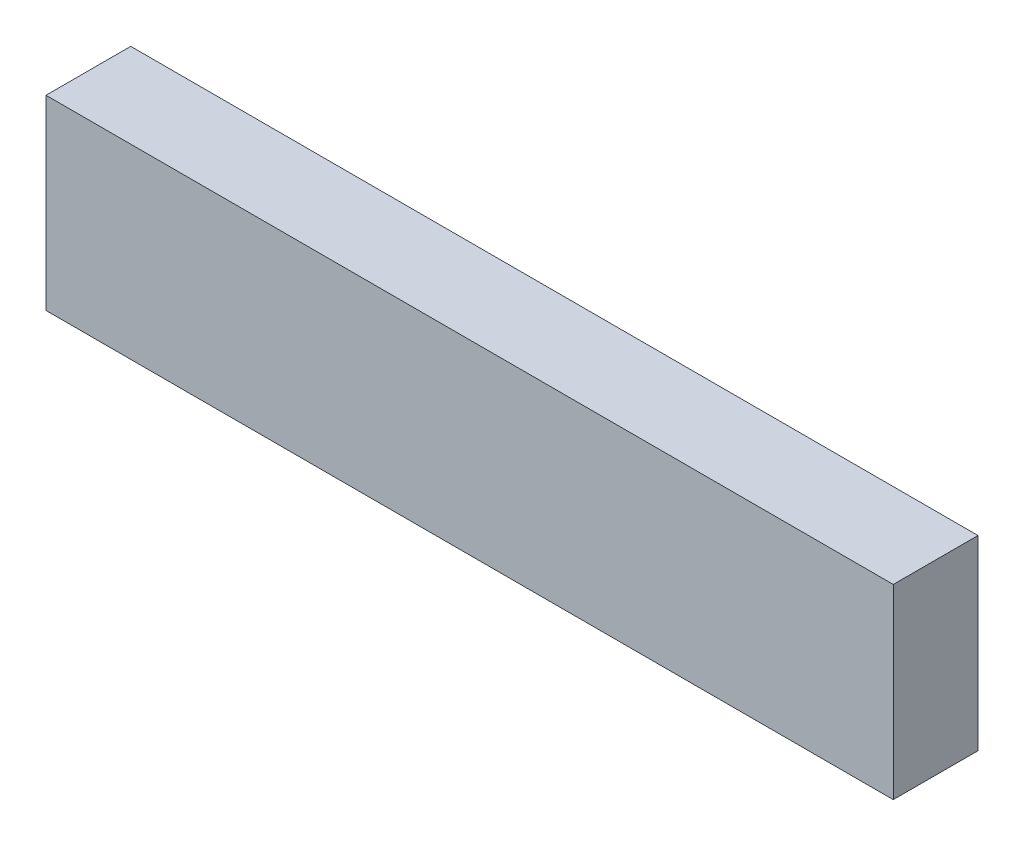
ISO-10303-21;
HEADER;
FILE_DESCRIPTION(('STEP AP214'),'2;1');
FILE_NAME('part.step','',(''),(''),'','','');
FILE_SCHEMA(('AUTOMOTIVE_DESIGN { 1 0 10303 214 1 1 1 1 }'));
ENDSEC;
DATA;
#1=APPLICATION_CONTEXT('core data for automotive mechanical design processes');
#2=APPLICATION_PROTOCOL_DEFINITION('international standard','automotive_design',2000,#1);
#3=PRODUCT_CONTEXT('',#1,'mechanical');
#4=PRODUCT('Part','Part','',(#3));
#5=PRODUCT_RELATED_PRODUCT_CATEGORY('part','',(#4));
#6=PRODUCT_DEFINITION_FORMATION('','',#4);
#7=PRODUCT_DEFINITION_CONTEXT('part definition',#1,'design');
#8=PRODUCT_DEFINITION('design','',#6,#7);
#9=PRODUCT_DEFINITION_SHAPE('','',#8);
#10=(LENGTH_UNIT() NAMED_UNIT(*) SI_UNIT(.MILLI.,.METRE.));
#11=(NAMED_UNIT(*) PLANE_ANGLE_UNIT() SI_UNIT($,.RADIAN.));
#12=(NAMED_UNIT(*) SI_UNIT($,.STERADIAN.) SOLID_ANGLE_UNIT());
#13=UNCERTAINTY_MEASURE_WITH_UNIT(LENGTH_MEASURE(1.E-05),#10,'distance_accuracy_value','');
#14=(GEOMETRIC_REPRESENTATION_CONTEXT(3) GLOBAL_UNCERTAINTY_ASSIGNED_CONTEXT((#13)) GLOBAL_UNIT_ASSIGNED_CONTEXT((#10,
#11,#12)) REPRESENTATION_CONTEXT('',''));
#15=CARTESIAN_POINT('',(0.,0.,0.));
#16=DIRECTION('',(0.,0.,1.));
#17=DIRECTION('',(1.,0.,0.));
#18=AXIS2_PLACEMENT_3D('',#15,#16,#17);
#19=CARTESIAN_POINT('',(-50.,11.,5.));
#20=DIRECTION('',(1.,0.,0.));
#21=DIRECTION('',(0.,0.,-1.));
#22=AXIS2_PLACEMENT_3D('',#19,#20,#21);
#23=PLANE('',#22);
#24=DIRECTION('',(0.,-1.,0.));
#25=VECTOR('',#24,1.);
#26=CARTESIAN_POINT('',(-50.,11.,0.));
#27=LINE('',#26,#25);
#28=CARTESIAN_POINT('',(-50.,11.,0.));
#29=VERTEX_POINT('',#28);
#30=CARTESIAN_POINT('',(-50.,0.,0.));
#31=VERTEX_POINT('',#30);
#32=EDGE_CURVE('E100',#29,#31,#27,.T.);
#33=ORIENTED_EDGE('',*,*,#32,.T.);
#34=DIRECTION('',(0.,0.,-1.));
#35=VECTOR('',#34,1.);
#36=CARTESIAN_POINT('',(-50.,0.,5.));
#37=LINE('',#36,#35);
#38=CARTESIAN_POINT('',(-50.,0.,5.));
#39=VERTEX_POINT('',#38);
#40=EDGE_CURVE('E11',#39,#31,#37,.T.);
#41=ORIENTED_EDGE('',*,*,#40,.F.);
#42=DIRECTION('',(0.,-1.,0.));
#43=VECTOR('',#42,1.);
#44=CARTESIAN_POINT('',(-50.,11.,5.));
#45=LINE('',#44,#43);
#46=CARTESIAN_POINT('',(-50.,11.,5.));
#47=VERTEX_POINT('',#46);
#48=EDGE_CURVE('E88',#47,#39,#45,.T.);
#49=ORIENTED_EDGE('',*,*,#48,.F.);
#50=DIRECTION('',(0.,0.,-1.));
#51=VECTOR('',#50,1.);
#52=CARTESIAN_POINT('',(-50.,11.,5.));
#53=LINE('',#52,#51);
#54=EDGE_CURVE('E96',#47,#29,#53,.T.);
#55=ORIENTED_EDGE('',*,*,#54,.T.);
#56=EDGE_LOOP('',(#33,#41,#49,#55));
#57=FACE_BOUND('',#56,.T.);
#58=ADVANCED_FACE('F37',(#57),#23,.F.);
#59=CARTESIAN_POINT('',(-50.,0.,5.));
#60=DIRECTION('',(0.,1.,0.));
#61=DIRECTION('',(0.,0.,1.));
#62=AXIS2_PLACEMENT_3D('',#59,#60,#61);
#63=PLANE('',#62);
#64=DIRECTION('',(1.,0.,0.));
#65=VECTOR('',#64,1.);
#66=CARTESIAN_POINT('',(-50.,0.,0.));
#67=LINE('',#66,#65);
#68=CARTESIAN_POINT('',(0.,0.,0.));
#69=VERTEX_POINT('',#68);
#70=EDGE_CURVE('E92',#31,#69,#67,.T.);
#71=ORIENTED_EDGE('',*,*,#70,.T.);
#72=DIRECTION('',(0.,0.,-1.));
#73=VECTOR('',#72,1.);
#74=CARTESIAN_POINT('',(0.,0.,5.));
#75=LINE('',#74,#73);
#76=CARTESIAN_POINT('',(0.,0.,5.));
#77=VERTEX_POINT('',#76);
#78=EDGE_CURVE('E45',#77,#69,#75,.T.);
#79=ORIENTED_EDGE('',*,*,#78,.F.);
#80=DIRECTION('',(1.,0.,0.));
#81=VECTOR('',#80,1.);
#82=CARTESIAN_POINT('',(-50.,0.,5.));
#83=LINE('',#82,#81);
#84=EDGE_CURVE('E83',#39,#77,#83,.T.);
#85=ORIENTED_EDGE('',*,*,#84,.F.);
#86=ORIENTED_EDGE('',*,*,#40,.T.);
#87=EDGE_LOOP('',(#71,#79,#85,#86));
#88=FACE_BOUND('',#87,.T.);
#89=ADVANCED_FACE('F91',(#88),#63,.F.);
#90=CARTESIAN_POINT('',(0.,11.,5.));
#91=DIRECTION('',(-1.,0.,0.));
#92=DIRECTION('',(0.,-1.,0.));
#93=AXIS2_PLACEMENT_3D('',#90,#91,#92);
#94=PLANE('',#93);
#95=DIRECTION('',(0.,1.,0.));
#96=VECTOR('',#95,1.);
#97=CARTESIAN_POINT('',(0.,11.,0.));
#98=LINE('',#97,#96);
#99=CARTESIAN_POINT('',(0.,11.,0.));
#100=VERTEX_POINT('',#99);
#101=EDGE_CURVE('E70',#69,#100,#98,.T.);
#102=ORIENTED_EDGE('',*,*,#101,.T.);
#103=DIRECTION('',(0.,0.,-1.));
#104=VECTOR('',#103,1.);
#105=CARTESIAN_POINT('',(0.,11.,5.));
#106=LINE('',#105,#104);
#107=CARTESIAN_POINT('',(0.,11.,5.));
#108=VERTEX_POINT('',#107);
#109=EDGE_CURVE('E93',#108,#100,#106,.T.);
#110=ORIENTED_EDGE('',*,*,#109,.F.);
#111=DIRECTION('',(0.,1.,0.));
#112=VECTOR('',#111,1.);
#113=CARTESIAN_POINT('',(0.,11.,5.));
#114=LINE('',#113,#112);
#115=EDGE_CURVE('E86',#77,#108,#114,.T.);
#116=ORIENTED_EDGE('',*,*,#115,.F.);
#117=ORIENTED_EDGE('',*,*,#78,.T.);
#118=EDGE_LOOP('',(#102,#110,#116,#117));
#119=FACE_BOUND('',#118,.T.);
#120=ADVANCED_FACE('F94',(#119),#94,.F.);
#121=CARTESIAN_POINT('',(-50.,11.,5.));
#122=DIRECTION('',(0.,-1.,0.));
#123=DIRECTION('',(0.,0.,-1.));
#124=AXIS2_PLACEMENT_3D('',#121,#122,#123);
#125=PLANE('',#124);
#126=DIRECTION('',(-1.,0.,0.));
#127=VECTOR('',#126,1.);
#128=CARTESIAN_POINT('',(-50.,11.,0.));
#129=LINE('',#128,#127);
#130=EDGE_CURVE('E76',#100,#29,#129,.T.);
#131=ORIENTED_EDGE('',*,*,#130,.T.);
#132=ORIENTED_EDGE('',*,*,#54,.F.);
#133=DIRECTION('',(-1.,0.,0.));
#134=VECTOR('',#133,1.);
#135=CARTESIAN_POINT('',(-50.,11.,5.));
#136=LINE('',#135,#134);
#137=EDGE_CURVE('E53',#108,#47,#136,.T.);
#138=ORIENTED_EDGE('',*,*,#137,.F.);
#139=ORIENTED_EDGE('',*,*,#109,.T.);
#140=EDGE_LOOP('',(#131,#132,#138,#139));
#141=FACE_BOUND('',#140,.T.);
#142=ADVANCED_FACE('F107',(#141),#125,.F.);
#143=CARTESIAN_POINT('',(0.,0.,5.));
#144=DIRECTION('',(0.,0.,1.));
#145=DIRECTION('',(1.,0.,0.));
#146=AXIS2_PLACEMENT_3D('',#143,#144,#145);
#147=PLANE('',#146);
#148=ORIENTED_EDGE('',*,*,#48,.T.);
#149=ORIENTED_EDGE('',*,*,#84,.T.);
#150=ORIENTED_EDGE('',*,*,#115,.T.);
#151=ORIENTED_EDGE('',*,*,#137,.T.);
#152=EDGE_LOOP('',(#148,#149,#150,#151));
#153=FACE_BOUND('',#152,.T.);
#154=ADVANCED_FACE('F84',(#153),#147,.T.);
#155=CARTESIAN_POINT('',(0.,0.,0.));
#156=DIRECTION('',(0.,0.,1.));
#157=DIRECTION('',(1.,0.,0.));
#158=AXIS2_PLACEMENT_3D('',#155,#156,#157);
#159=PLANE('',#158);
#160=ORIENTED_EDGE('',*,*,#32,.F.);
#161=ORIENTED_EDGE('',*,*,#130,.F.);
#162=ORIENTED_EDGE('',*,*,#101,.F.);
#163=ORIENTED_EDGE('',*,*,#70,.F.);
#164=EDGE_LOOP('',(#160,#161,#162,#163));
#165=FACE_BOUND('',#164,.T.);
#166=ADVANCED_FACE('F110',(#165),#159,.F.);
#167=CLOSED_SHELL('',(#58,#89,#120,#142,#154,#166));
#168=MANIFOLD_SOLID_BREP('B2',#167);
#169=ADVANCED_BREP_SHAPE_REPRESENTATION('',(#18,#168),#14);
#170=SHAPE_DEFINITION_REPRESENTATION(#9,#169);
ENDSEC;
END-ISO-10303-21;
